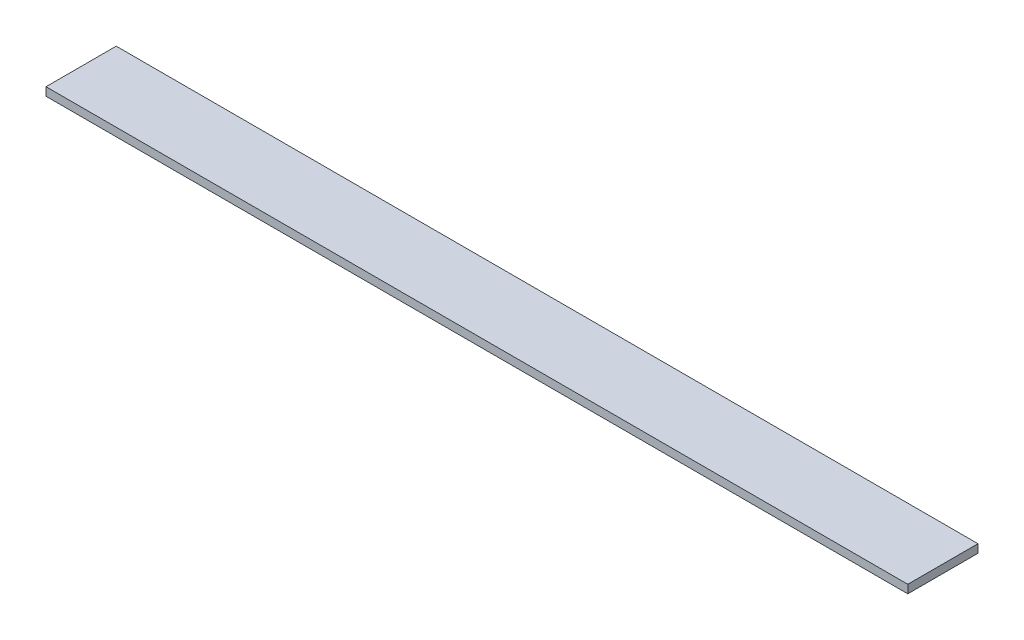
ISO-10303-21;
HEADER;
FILE_DESCRIPTION(('STEP AP214'),'2;1');
FILE_NAME('part.step','',(''),(''),'','','');
FILE_SCHEMA(('AUTOMOTIVE_DESIGN { 1 0 10303 214 1 1 1 1 }'));
ENDSEC;
DATA;
#1=APPLICATION_CONTEXT('core data for automotive mechanical design processes');
#2=APPLICATION_PROTOCOL_DEFINITION('international standard','automotive_design',2000,#1);
#3=PRODUCT_CONTEXT('',#1,'mechanical');
#4=PRODUCT('Part','Part','',(#3));
#5=PRODUCT_RELATED_PRODUCT_CATEGORY('part','',(#4));
#6=PRODUCT_DEFINITION_FORMATION('','',#4);
#7=PRODUCT_DEFINITION_CONTEXT('part definition',#1,'design');
#8=PRODUCT_DEFINITION('design','',#6,#7);
#9=PRODUCT_DEFINITION_SHAPE('','',#8);
#10=(LENGTH_UNIT() NAMED_UNIT(*) SI_UNIT(.MILLI.,.METRE.));
#11=(NAMED_UNIT(*) PLANE_ANGLE_UNIT() SI_UNIT($,.RADIAN.));
#12=(NAMED_UNIT(*) SI_UNIT($,.STERADIAN.) SOLID_ANGLE_UNIT());
#13=UNCERTAINTY_MEASURE_WITH_UNIT(LENGTH_MEASURE(1.E-05),#10,'distance_accuracy_value','');
#14=(GEOMETRIC_REPRESENTATION_CONTEXT(3) GLOBAL_UNCERTAINTY_ASSIGNED_CONTEXT((#13)) GLOBAL_UNIT_ASSIGNED_CONTEXT((#10,
#11,#12)) REPRESENTATION_CONTEXT('',''));
#15=CARTESIAN_POINT('',(0.,0.,0.));
#16=DIRECTION('',(0.,0.,1.));
#17=DIRECTION('',(1.,0.,0.));
#18=AXIS2_PLACEMENT_3D('',#15,#16,#17);
#19=CARTESIAN_POINT('',(-15.625,1.3,-7.5));
#20=DIRECTION('',(1.,0.,0.));
#21=DIRECTION('',(0.,0.,-1.));
#22=AXIS2_PLACEMENT_3D('',#19,#20,#21);
#23=PLANE('',#22);
#24=DIRECTION('',(0.,0.,1.));
#25=VECTOR('',#24,1.);
#26=CARTESIAN_POINT('',(-15.625,0.,-7.5));
#27=LINE('',#26,#25);
#28=CARTESIAN_POINT('',(-15.625,0.,-7.5));
#29=VERTEX_POINT('',#28);
#30=CARTESIAN_POINT('',(-15.625,0.,3.5));
#31=VERTEX_POINT('',#30);
#32=EDGE_CURVE('E89',#29,#31,#27,.T.);
#33=ORIENTED_EDGE('',*,*,#32,.T.);
#34=DIRECTION('',(0.,-1.,0.));
#35=VECTOR('',#34,1.);
#36=CARTESIAN_POINT('',(-15.625,1.3,3.5));
#37=LINE('',#36,#35);
#38=CARTESIAN_POINT('',(-15.625,1.3,3.5));
#39=VERTEX_POINT('',#38);
#40=EDGE_CURVE('E11',#39,#31,#37,.T.);
#41=ORIENTED_EDGE('',*,*,#40,.F.);
#42=DIRECTION('',(0.,0.,1.));
#43=VECTOR('',#42,1.);
#44=CARTESIAN_POINT('',(-15.625,1.3,-7.5));
#45=LINE('',#44,#43);
#46=CARTESIAN_POINT('',(-15.625,1.3,-7.5));
#47=VERTEX_POINT('',#46);
#48=EDGE_CURVE('E105',#47,#39,#45,.T.);
#49=ORIENTED_EDGE('',*,*,#48,.F.);
#50=DIRECTION('',(0.,-1.,0.));
#51=VECTOR('',#50,1.);
#52=CARTESIAN_POINT('',(-15.625,1.3,-7.5));
#53=LINE('',#52,#51);
#54=EDGE_CURVE('E49',#47,#29,#53,.T.);
#55=ORIENTED_EDGE('',*,*,#54,.T.);
#56=EDGE_LOOP('',(#33,#41,#49,#55));
#57=FACE_BOUND('',#56,.T.);
#58=ADVANCED_FACE('F41',(#57),#23,.F.);
#59=CARTESIAN_POINT('',(-15.625,1.3,3.5));
#60=DIRECTION('',(0.,0.,-1.));
#61=DIRECTION('',(-1.,0.,0.));
#62=AXIS2_PLACEMENT_3D('',#59,#60,#61);
#63=PLANE('',#62);
#64=DIRECTION('',(1.,0.,0.));
#65=VECTOR('',#64,1.);
#66=CARTESIAN_POINT('',(-15.625,0.,3.5));
#67=LINE('',#66,#65);
#68=CARTESIAN_POINT('',(119.375,0.,3.5));
#69=VERTEX_POINT('',#68);
#70=EDGE_CURVE('E69',#31,#69,#67,.T.);
#71=ORIENTED_EDGE('',*,*,#70,.T.);
#72=DIRECTION('',(0.,-1.,0.));
#73=VECTOR('',#72,1.);
#74=CARTESIAN_POINT('',(119.375,1.3,3.5));
#75=LINE('',#74,#73);
#76=CARTESIAN_POINT('',(119.375,1.3,3.5));
#77=VERTEX_POINT('',#76);
#78=EDGE_CURVE('E85',#77,#69,#75,.T.);
#79=ORIENTED_EDGE('',*,*,#78,.F.);
#80=DIRECTION('',(1.,0.,0.));
#81=VECTOR('',#80,1.);
#82=CARTESIAN_POINT('',(-15.625,1.3,3.5));
#83=LINE('',#82,#81);
#84=EDGE_CURVE('E73',#39,#77,#83,.T.);
#85=ORIENTED_EDGE('',*,*,#84,.F.);
#86=ORIENTED_EDGE('',*,*,#40,.T.);
#87=EDGE_LOOP('',(#71,#79,#85,#86));
#88=FACE_BOUND('',#87,.T.);
#89=ADVANCED_FACE('F83',(#88),#63,.F.);
#90=CARTESIAN_POINT('',(-15.625,1.3,-7.5));
#91=DIRECTION('',(0.,0.,1.));
#92=DIRECTION('',(1.,0.,0.));
#93=AXIS2_PLACEMENT_3D('',#90,#91,#92);
#94=PLANE('',#93);
#95=DIRECTION('',(-1.,0.,0.));
#96=VECTOR('',#95,1.);
#97=CARTESIAN_POINT('',(-15.625,0.,-7.5));
#98=LINE('',#97,#96);
#99=CARTESIAN_POINT('',(119.375,0.,-7.5));
#100=VERTEX_POINT('',#99);
#101=EDGE_CURVE('E88',#100,#29,#98,.T.);
#102=ORIENTED_EDGE('',*,*,#101,.T.);
#103=ORIENTED_EDGE('',*,*,#54,.F.);
#104=DIRECTION('',(-1.,0.,0.));
#105=VECTOR('',#104,1.);
#106=CARTESIAN_POINT('',(-15.625,1.3,-7.5));
#107=LINE('',#106,#105);
#108=CARTESIAN_POINT('',(119.375,1.3,-7.5));
#109=VERTEX_POINT('',#108);
#110=EDGE_CURVE('E57',#109,#47,#107,.T.);
#111=ORIENTED_EDGE('',*,*,#110,.F.);
#112=DIRECTION('',(0.,1.,0.));
#113=VECTOR('',#112,1.);
#114=CARTESIAN_POINT('',(119.375,1.3,-7.5));
#115=LINE('',#114,#113);
#116=EDGE_CURVE('E97',#100,#109,#115,.T.);
#117=ORIENTED_EDGE('',*,*,#116,.F.);
#118=EDGE_LOOP('',(#102,#103,#111,#117));
#119=FACE_BOUND('',#118,.T.);
#120=ADVANCED_FACE('F114',(#119),#94,.F.);
#121=CARTESIAN_POINT('',(0.,1.3,0.));
#122=DIRECTION('',(0.,1.,0.));
#123=DIRECTION('',(0.,0.,1.));
#124=AXIS2_PLACEMENT_3D('',#121,#122,#123);
#125=PLANE('',#124);
#126=ORIENTED_EDGE('',*,*,#48,.T.);
#127=ORIENTED_EDGE('',*,*,#84,.T.);
#128=DIRECTION('',(0.,0.,1.));
#129=VECTOR('',#128,1.);
#130=CARTESIAN_POINT('',(119.375,1.3,3.5));
#131=LINE('',#130,#129);
#132=EDGE_CURVE('E100',#109,#77,#131,.T.);
#133=ORIENTED_EDGE('',*,*,#132,.F.);
#134=ORIENTED_EDGE('',*,*,#110,.T.);
#135=EDGE_LOOP('',(#126,#127,#133,#134));
#136=FACE_BOUND('',#135,.T.);
#137=ADVANCED_FACE('F115',(#136),#125,.T.);
#138=CARTESIAN_POINT('',(0.,0.,0.));
#139=DIRECTION('',(0.,1.,0.));
#140=DIRECTION('',(0.,0.,1.));
#141=AXIS2_PLACEMENT_3D('',#138,#139,#140);
#142=PLANE('',#141);
#143=ORIENTED_EDGE('',*,*,#32,.F.);
#144=ORIENTED_EDGE('',*,*,#101,.F.);
#145=DIRECTION('',(0.,0.,-1.));
#146=VECTOR('',#145,1.);
#147=CARTESIAN_POINT('',(119.375,0.,3.5));
#148=LINE('',#147,#146);
#149=EDGE_CURVE('E92',#69,#100,#148,.T.);
#150=ORIENTED_EDGE('',*,*,#149,.F.);
#151=ORIENTED_EDGE('',*,*,#70,.F.);
#152=EDGE_LOOP('',(#143,#144,#150,#151));
#153=FACE_BOUND('',#152,.T.);
#154=ADVANCED_FACE('F93',(#153),#142,.F.);
#155=CARTESIAN_POINT('',(119.375,0.,0.));
#156=DIRECTION('',(1.,0.,0.));
#157=DIRECTION('',(0.,0.,-1.));
#158=AXIS2_PLACEMENT_3D('',#155,#156,#157);
#159=PLANE('',#158);
#160=ORIENTED_EDGE('',*,*,#78,.T.);
#161=ORIENTED_EDGE('',*,*,#149,.T.);
#162=ORIENTED_EDGE('',*,*,#116,.T.);
#163=ORIENTED_EDGE('',*,*,#132,.T.);
#164=EDGE_LOOP('',(#160,#161,#162,#163));
#165=FACE_BOUND('',#164,.T.);
#166=ADVANCED_FACE('F99',(#165),#159,.T.);
#167=CLOSED_SHELL('',(#58,#89,#120,#137,#154,#166));
#168=MANIFOLD_SOLID_BREP('B2',#167);
#169=ADVANCED_BREP_SHAPE_REPRESENTATION('',(#18,#168),#14);
#170=SHAPE_DEFINITION_REPRESENTATION(#9,#169);
ENDSEC;
END-ISO-10303-21;
